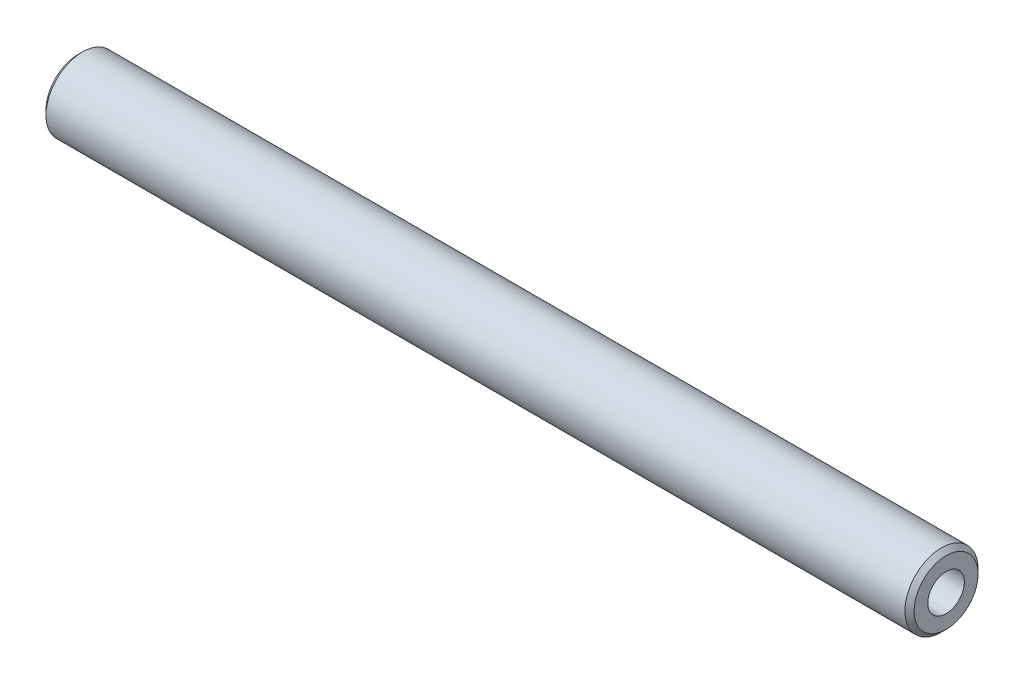
ISO-10303-21;
HEADER;
FILE_DESCRIPTION(('STEP AP214'),'2;1');
FILE_NAME('part.step','',(''),(''),'','','');
FILE_SCHEMA(('AUTOMOTIVE_DESIGN { 1 0 10303 214 1 1 1 1 }'));
ENDSEC;
DATA;
#1=APPLICATION_CONTEXT('core data for automotive mechanical design processes');
#2=APPLICATION_PROTOCOL_DEFINITION('international standard','automotive_design',2000,#1);
#3=PRODUCT_CONTEXT('',#1,'mechanical');
#4=PRODUCT('Part','Part','',(#3));
#5=PRODUCT_RELATED_PRODUCT_CATEGORY('part','',(#4));
#6=PRODUCT_DEFINITION_FORMATION('','',#4);
#7=PRODUCT_DEFINITION_CONTEXT('part definition',#1,'design');
#8=PRODUCT_DEFINITION('design','',#6,#7);
#9=PRODUCT_DEFINITION_SHAPE('','',#8);
#10=(LENGTH_UNIT() NAMED_UNIT(*) SI_UNIT(.MILLI.,.METRE.));
#11=(NAMED_UNIT(*) PLANE_ANGLE_UNIT() SI_UNIT($,.RADIAN.));
#12=(NAMED_UNIT(*) SI_UNIT($,.STERADIAN.) SOLID_ANGLE_UNIT());
#13=UNCERTAINTY_MEASURE_WITH_UNIT(LENGTH_MEASURE(1.E-05),#10,'distance_accuracy_value','');
#14=(GEOMETRIC_REPRESENTATION_CONTEXT(3) GLOBAL_UNCERTAINTY_ASSIGNED_CONTEXT((#13)) GLOBAL_UNIT_ASSIGNED_CONTEXT((#10,
#11,#12)) REPRESENTATION_CONTEXT('',''));
#15=CARTESIAN_POINT('',(0.,0.,0.));
#16=DIRECTION('',(0.,0.,1.));
#17=DIRECTION('',(1.,0.,0.));
#18=AXIS2_PLACEMENT_3D('',#15,#16,#17);
#19=CARTESIAN_POINT('',(-47.5,0.,0.));
#20=DIRECTION('',(1.,0.,0.));
#21=DIRECTION('',(0.,0.,-1.));
#22=AXIS2_PLACEMENT_3D('',#19,#20,#21);
#23=PLANE('',#22);
#24=CARTESIAN_POINT('',(-47.5,0.,0.));
#25=DIRECTION('',(1.,0.,0.));
#26=DIRECTION('',(0.,0.,-1.));
#27=AXIS2_PLACEMENT_3D('',#24,#25,#26);
#28=CIRCLE('',#27,3.49999999999999);
#29=CARTESIAN_POINT('',(-47.5,0.,-3.49999999999999));
#30=VERTEX_POINT('',#29);
#31=EDGE_CURVE('E77',#30,#30,#28,.F.);
#32=ORIENTED_EDGE('',*,*,#31,.T.);
#33=EDGE_LOOP('',(#32));
#34=FACE_BOUND('',#33,.T.);
#35=CARTESIAN_POINT('',(-47.5,0.,0.));
#36=DIRECTION('',(-1.,0.,0.));
#37=DIRECTION('',(0.,0.,1.));
#38=AXIS2_PLACEMENT_3D('',#35,#36,#37);
#39=CIRCLE('',#38,2.);
#40=CARTESIAN_POINT('',(-47.5,0.,2.));
#41=VERTEX_POINT('',#40);
#42=EDGE_CURVE('E58',#41,#41,#39,.T.);
#43=ORIENTED_EDGE('',*,*,#42,.F.);
#44=EDGE_LOOP('',(#43));
#45=FACE_BOUND('',#44,.T.);
#46=ADVANCED_FACE('F34',(#34,#45),#23,.F.);
#47=CARTESIAN_POINT('',(0.,0.,0.));
#48=DIRECTION('',(-1.,0.,0.));
#49=DIRECTION('',(0.,0.,1.));
#50=AXIS2_PLACEMENT_3D('',#47,#48,#49);
#51=CYLINDRICAL_SURFACE('',#50,4.00000000000001);
#52=CARTESIAN_POINT('',(-47.,0.,0.));
#53=DIRECTION('',(1.,0.,0.));
#54=DIRECTION('',(0.,0.,-1.));
#55=AXIS2_PLACEMENT_3D('',#52,#53,#54);
#56=CIRCLE('',#55,4.00000000000001);
#57=CARTESIAN_POINT('',(-47.,0.,-4.00000000000001));
#58=VERTEX_POINT('',#57);
#59=EDGE_CURVE('E42',#58,#58,#56,.T.);
#60=ORIENTED_EDGE('',*,*,#59,.T.);
#61=EDGE_LOOP('',(#60));
#62=FACE_BOUND('',#61,.T.);
#63=CARTESIAN_POINT('',(47.,0.,0.));
#64=DIRECTION('',(-1.,0.,0.));
#65=DIRECTION('',(0.,0.,1.));
#66=AXIS2_PLACEMENT_3D('',#63,#64,#65);
#67=CIRCLE('',#66,4.00000000000001);
#68=CARTESIAN_POINT('',(47.,0.,4.00000000000001));
#69=VERTEX_POINT('',#68);
#70=EDGE_CURVE('E80',#69,#69,#67,.T.);
#71=ORIENTED_EDGE('',*,*,#70,.T.);
#72=EDGE_LOOP('',(#71));
#73=FACE_BOUND('',#72,.T.);
#74=ADVANCED_FACE('F85',(#62,#73),#51,.T.);
#75=CARTESIAN_POINT('',(47.5,0.,0.));
#76=DIRECTION('',(-1.,0.,0.));
#77=DIRECTION('',(0.,0.,1.));
#78=AXIS2_PLACEMENT_3D('',#75,#76,#77);
#79=PLANE('',#78);
#80=CARTESIAN_POINT('',(47.5,0.,0.));
#81=DIRECTION('',(-1.,0.,0.));
#82=DIRECTION('',(0.,0.,1.));
#83=AXIS2_PLACEMENT_3D('',#80,#81,#82);
#84=CIRCLE('',#83,3.5);
#85=CARTESIAN_POINT('',(47.5,0.,3.5));
#86=VERTEX_POINT('',#85);
#87=EDGE_CURVE('E11',#86,#86,#84,.F.);
#88=ORIENTED_EDGE('',*,*,#87,.T.);
#89=EDGE_LOOP('',(#88));
#90=FACE_BOUND('',#89,.T.);
#91=CARTESIAN_POINT('',(47.5,0.,0.));
#92=DIRECTION('',(1.,0.,0.));
#93=DIRECTION('',(0.,0.,-1.));
#94=AXIS2_PLACEMENT_3D('',#91,#92,#93);
#95=CIRCLE('',#94,2.);
#96=CARTESIAN_POINT('',(47.5,0.,-2.));
#97=VERTEX_POINT('',#96);
#98=EDGE_CURVE('E219',#97,#97,#95,.T.);
#99=ORIENTED_EDGE('',*,*,#98,.F.);
#100=EDGE_LOOP('',(#99));
#101=FACE_BOUND('',#100,.T.);
#102=ADVANCED_FACE('F118',(#90,#101),#79,.F.);
#103=CARTESIAN_POINT('',(-36.,0.,0.));
#104=DIRECTION('',(-1.,0.,0.));
#105=DIRECTION('',(0.,0.,1.));
#106=AXIS2_PLACEMENT_3D('',#103,#104,#105);
#107=CONICAL_SURFACE('',#106,1.65,1.02974425867665);
#108=CARTESIAN_POINT('',(-35.0085799786045,0.,0.));
#109=VERTEX_POINT('',#108);
#110=VERTEX_LOOP('',#109);
#111=FACE_BOUND('',#110,.T.);
#112=CARTESIAN_POINT('',(-36.,0.,0.));
#113=DIRECTION('',(-1.,0.,0.));
#114=DIRECTION('',(0.,0.,1.));
#115=AXIS2_PLACEMENT_3D('',#112,#113,#114);
#116=CIRCLE('',#115,1.65);
#117=CARTESIAN_POINT('',(-36.,0.,1.65));
#118=VERTEX_POINT('',#117);
#119=EDGE_CURVE('E74',#118,#118,#116,.T.);
#120=ORIENTED_EDGE('',*,*,#119,.T.);
#121=EDGE_LOOP('',(#120));
#122=FACE_BOUND('',#121,.T.);
#123=ADVANCED_FACE('F114',(#111,#122),#107,.F.);
#124=CARTESIAN_POINT('',(-47.5,0.,0.));
#125=DIRECTION('',(-1.,0.,0.));
#126=DIRECTION('',(0.,0.,1.));
#127=AXIS2_PLACEMENT_3D('',#124,#125,#126);
#128=CYLINDRICAL_SURFACE('',#127,1.65);
#129=ORIENTED_EDGE('',*,*,#119,.F.);
#130=EDGE_LOOP('',(#129));
#131=FACE_BOUND('',#130,.T.);
#132=CARTESIAN_POINT('',(-39.5,0.,0.));
#133=DIRECTION('',(-1.,0.,0.));
#134=DIRECTION('',(0.,0.,1.));
#135=AXIS2_PLACEMENT_3D('',#132,#133,#134);
#136=CIRCLE('',#135,1.65);
#137=CARTESIAN_POINT('',(-39.5,0.,1.65));
#138=VERTEX_POINT('',#137);
#139=EDGE_CURVE('E71',#138,#138,#136,.T.);
#140=ORIENTED_EDGE('',*,*,#139,.T.);
#141=EDGE_LOOP('',(#140));
#142=FACE_BOUND('',#141,.T.);
#143=ADVANCED_FACE('F106',(#131,#142),#128,.F.);
#144=CARTESIAN_POINT('',(-39.5,1.65,0.));
#145=DIRECTION('',(1.,0.,0.));
#146=DIRECTION('',(0.,0.,-1.));
#147=AXIS2_PLACEMENT_3D('',#144,#145,#146);
#148=PLANE('',#147);
#149=ORIENTED_EDGE('',*,*,#139,.F.);
#150=EDGE_LOOP('',(#149));
#151=FACE_BOUND('',#150,.T.);
#152=CARTESIAN_POINT('',(-39.5,0.,0.));
#153=DIRECTION('',(-1.,0.,0.));
#154=DIRECTION('',(0.,0.,1.));
#155=AXIS2_PLACEMENT_3D('',#152,#153,#154);
#156=CIRCLE('',#155,2.);
#157=CARTESIAN_POINT('',(-39.5,0.,2.));
#158=VERTEX_POINT('',#157);
#159=EDGE_CURVE('E62',#158,#158,#156,.T.);
#160=ORIENTED_EDGE('',*,*,#159,.T.);
#161=EDGE_LOOP('',(#160));
#162=FACE_BOUND('',#161,.T.);
#163=ADVANCED_FACE('F100',(#151,#162),#148,.F.);
#164=CARTESIAN_POINT('',(-47.5,0.,0.));
#165=DIRECTION('',(-1.,0.,0.));
#166=DIRECTION('',(0.,0.,1.));
#167=AXIS2_PLACEMENT_3D('',#164,#165,#166);
#168=CYLINDRICAL_SURFACE('',#167,2.);
#169=ORIENTED_EDGE('',*,*,#159,.F.);
#170=EDGE_LOOP('',(#169));
#171=FACE_BOUND('',#170,.T.);
#172=ORIENTED_EDGE('',*,*,#42,.T.);
#173=EDGE_LOOP('',(#172));
#174=FACE_BOUND('',#173,.T.);
#175=ADVANCED_FACE('F52',(#171,#174),#168,.F.);
#176=CARTESIAN_POINT('',(36.,0.,0.));
#177=DIRECTION('',(1.,0.,0.));
#178=DIRECTION('',(0.,0.,-1.));
#179=AXIS2_PLACEMENT_3D('',#176,#177,#178);
#180=CONICAL_SURFACE('',#179,1.65,1.02974425867665);
#181=CARTESIAN_POINT('',(35.0085799786045,0.,0.));
#182=VERTEX_POINT('',#181);
#183=VERTEX_LOOP('',#182);
#184=FACE_BOUND('',#183,.T.);
#185=CARTESIAN_POINT('',(36.,0.,0.));
#186=DIRECTION('',(1.,0.,0.));
#187=DIRECTION('',(0.,0.,-1.));
#188=AXIS2_PLACEMENT_3D('',#185,#186,#187);
#189=CIRCLE('',#188,1.65);
#190=CARTESIAN_POINT('',(36.,0.,-1.65));
#191=VERTEX_POINT('',#190);
#192=EDGE_CURVE('E56',#191,#191,#189,.T.);
#193=ORIENTED_EDGE('',*,*,#192,.T.);
#194=EDGE_LOOP('',(#193));
#195=FACE_BOUND('',#194,.T.);
#196=ADVANCED_FACE('F48',(#184,#195),#180,.F.);
#197=CARTESIAN_POINT('',(47.5,0.,0.));
#198=DIRECTION('',(1.,0.,0.));
#199=DIRECTION('',(0.,0.,-1.));
#200=AXIS2_PLACEMENT_3D('',#197,#198,#199);
#201=CYLINDRICAL_SURFACE('',#200,1.65);
#202=ORIENTED_EDGE('',*,*,#192,.F.);
#203=EDGE_LOOP('',(#202));
#204=FACE_BOUND('',#203,.T.);
#205=CARTESIAN_POINT('',(39.5,0.,0.));
#206=DIRECTION('',(1.,0.,0.));
#207=DIRECTION('',(0.,0.,-1.));
#208=AXIS2_PLACEMENT_3D('',#205,#206,#207);
#209=CIRCLE('',#208,1.65);
#210=CARTESIAN_POINT('',(39.5,0.,-1.65));
#211=VERTEX_POINT('',#210);
#212=EDGE_CURVE('E59',#211,#211,#209,.T.);
#213=ORIENTED_EDGE('',*,*,#212,.T.);
#214=EDGE_LOOP('',(#213));
#215=FACE_BOUND('',#214,.T.);
#216=ADVANCED_FACE('F51',(#204,#215),#201,.F.);
#217=CARTESIAN_POINT('',(39.5,1.65,0.));
#218=DIRECTION('',(-1.,0.,0.));
#219=DIRECTION('',(0.,0.,1.));
#220=AXIS2_PLACEMENT_3D('',#217,#218,#219);
#221=PLANE('',#220);
#222=ORIENTED_EDGE('',*,*,#212,.F.);
#223=EDGE_LOOP('',(#222));
#224=FACE_BOUND('',#223,.T.);
#225=CARTESIAN_POINT('',(39.5,0.,0.));
#226=DIRECTION('',(1.,0.,0.));
#227=DIRECTION('',(0.,0.,-1.));
#228=AXIS2_PLACEMENT_3D('',#225,#226,#227);
#229=CIRCLE('',#228,2.);
#230=CARTESIAN_POINT('',(39.5,0.,-2.));
#231=VERTEX_POINT('',#230);
#232=EDGE_CURVE('E65',#231,#231,#229,.T.);
#233=ORIENTED_EDGE('',*,*,#232,.T.);
#234=EDGE_LOOP('',(#233));
#235=FACE_BOUND('',#234,.T.);
#236=ADVANCED_FACE('F166',(#224,#235),#221,.F.);
#237=CARTESIAN_POINT('',(47.5,0.,0.));
#238=DIRECTION('',(1.,0.,0.));
#239=DIRECTION('',(0.,0.,-1.));
#240=AXIS2_PLACEMENT_3D('',#237,#238,#239);
#241=CYLINDRICAL_SURFACE('',#240,2.);
#242=ORIENTED_EDGE('',*,*,#232,.F.);
#243=EDGE_LOOP('',(#242));
#244=FACE_BOUND('',#243,.T.);
#245=ORIENTED_EDGE('',*,*,#98,.T.);
#246=EDGE_LOOP('',(#245));
#247=FACE_BOUND('',#246,.T.);
#248=ADVANCED_FACE('F91',(#244,#247),#241,.F.);
#249=CARTESIAN_POINT('',(-47.5,0.,0.));
#250=DIRECTION('',(1.,0.,0.));
#251=DIRECTION('',(0.,0.,-1.));
#252=AXIS2_PLACEMENT_3D('',#249,#250,#251);
#253=CONICAL_SURFACE('',#252,3.49999999999999,0.785398163397447);
#254=ORIENTED_EDGE('',*,*,#59,.F.);
#255=EDGE_LOOP('',(#254));
#256=FACE_BOUND('',#255,.T.);
#257=ORIENTED_EDGE('',*,*,#31,.F.);
#258=EDGE_LOOP('',(#257));
#259=FACE_BOUND('',#258,.T.);
#260=ADVANCED_FACE('F88',(#256,#259),#253,.T.);
#261=CARTESIAN_POINT('',(47.,0.,0.));
#262=DIRECTION('',(-1.,0.,0.));
#263=DIRECTION('',(0.,0.,1.));
#264=AXIS2_PLACEMENT_3D('',#261,#262,#263);
#265=CONICAL_SURFACE('',#264,4.00000000000001,0.785398163397447);
#266=ORIENTED_EDGE('',*,*,#87,.F.);
#267=EDGE_LOOP('',(#266));
#268=FACE_BOUND('',#267,.T.);
#269=ORIENTED_EDGE('',*,*,#70,.F.);
#270=EDGE_LOOP('',(#269));
#271=FACE_BOUND('',#270,.T.);
#272=ADVANCED_FACE('F36',(#268,#271),#265,.T.);
#273=CLOSED_SHELL('',(#46,#74,#102,#123,#143,#163,#175,#196,#216,#236,#248,#260,#272));
#274=MANIFOLD_SOLID_BREP('B2',#273);
#275=ADVANCED_BREP_SHAPE_REPRESENTATION('',(#18,#274),#14);
#276=SHAPE_DEFINITION_REPRESENTATION(#9,#275);
ENDSEC;
END-ISO-10303-21;
